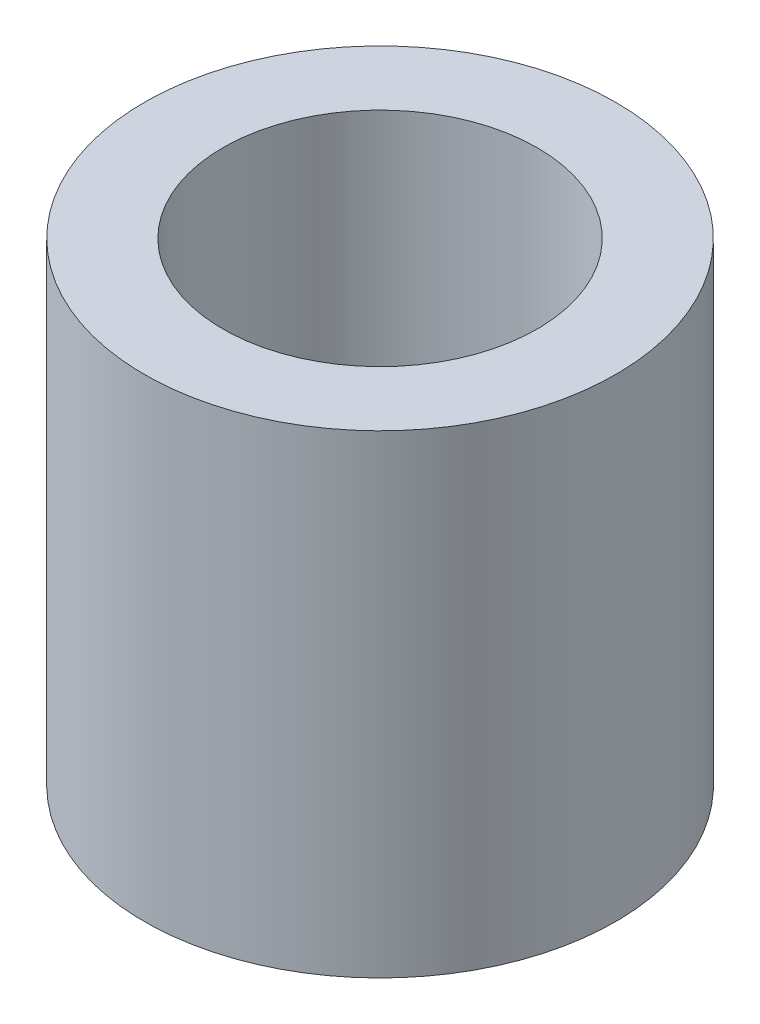
ISO-10303-21;
HEADER;
FILE_DESCRIPTION(('STEP AP214'),'2;1');
FILE_NAME('part.step','',(''),(''),'','','');
FILE_SCHEMA(('AUTOMOTIVE_DESIGN { 1 0 10303 214 1 1 1 1 }'));
ENDSEC;
DATA;
#1=APPLICATION_CONTEXT('core data for automotive mechanical design processes');
#2=APPLICATION_PROTOCOL_DEFINITION('international standard','automotive_design',2000,#1);
#3=PRODUCT_CONTEXT('',#1,'mechanical');
#4=PRODUCT('Part','Part','',(#3));
#5=PRODUCT_RELATED_PRODUCT_CATEGORY('part','',(#4));
#6=PRODUCT_DEFINITION_FORMATION('','',#4);
#7=PRODUCT_DEFINITION_CONTEXT('part definition',#1,'design');
#8=PRODUCT_DEFINITION('design','',#6,#7);
#9=PRODUCT_DEFINITION_SHAPE('','',#8);
#10=(LENGTH_UNIT() NAMED_UNIT(*) SI_UNIT(.MILLI.,.METRE.));
#11=(NAMED_UNIT(*) PLANE_ANGLE_UNIT() SI_UNIT($,.RADIAN.));
#12=(NAMED_UNIT(*) SI_UNIT($,.STERADIAN.) SOLID_ANGLE_UNIT());
#13=UNCERTAINTY_MEASURE_WITH_UNIT(LENGTH_MEASURE(1.E-05),#10,'distance_accuracy_value','');
#14=(GEOMETRIC_REPRESENTATION_CONTEXT(3) GLOBAL_UNCERTAINTY_ASSIGNED_CONTEXT((#13)) GLOBAL_UNIT_ASSIGNED_CONTEXT((#10,
#11,#12)) REPRESENTATION_CONTEXT('',''));
#15=CARTESIAN_POINT('',(0.,0.,0.));
#16=DIRECTION('',(0.,0.,1.));
#17=DIRECTION('',(1.,0.,0.));
#18=AXIS2_PLACEMENT_3D('',#15,#16,#17);
#19=CARTESIAN_POINT('',(0.,6.03156727044344,0.));
#20=DIRECTION('',(0.,1.,0.));
#21=DIRECTION('',(0.,0.,1.));
#22=AXIS2_PLACEMENT_3D('',#19,#20,#21);
#23=PLANE('',#22);
#24=CARTESIAN_POINT('',(0.,6.03156727044344,0.));
#25=DIRECTION('',(0.,1.,0.));
#26=DIRECTION('',(0.,0.,1.));
#27=AXIS2_PLACEMENT_3D('',#24,#25,#26);
#28=CIRCLE('',#27,3.);
#29=CARTESIAN_POINT('',(0.,6.03156727044344,-3.));
#30=VERTEX_POINT('',#29);
#31=EDGE_CURVE('E10',#30,#30,#28,.T.);
#32=ORIENTED_EDGE('',*,*,#31,.T.);
#33=EDGE_LOOP('',(#32));
#34=FACE_BOUND('',#33,.T.);
#35=CARTESIAN_POINT('',(0.,6.03156727044344,0.));
#36=DIRECTION('',(0.,1.,0.));
#37=DIRECTION('',(0.,0.,1.));
#38=AXIS2_PLACEMENT_3D('',#35,#36,#37);
#39=CIRCLE('',#38,2.);
#40=CARTESIAN_POINT('',(0.,6.03156727044344,-2.));
#41=VERTEX_POINT('',#40);
#42=EDGE_CURVE('E46',#41,#41,#39,.T.);
#43=ORIENTED_EDGE('',*,*,#42,.F.);
#44=EDGE_LOOP('',(#43));
#45=FACE_BOUND('',#44,.T.);
#46=ADVANCED_FACE('F35',(#34,#45),#23,.T.);
#47=CARTESIAN_POINT('',(0.,0.,0.));
#48=DIRECTION('',(0.,1.,0.));
#49=DIRECTION('',(0.,0.,1.));
#50=AXIS2_PLACEMENT_3D('',#47,#48,#49);
#51=PLANE('',#50);
#52=CARTESIAN_POINT('',(0.,0.,0.));
#53=DIRECTION('',(0.,1.,0.));
#54=DIRECTION('',(0.,0.,1.));
#55=AXIS2_PLACEMENT_3D('',#52,#53,#54);
#56=CIRCLE('',#55,3.);
#57=CARTESIAN_POINT('',(0.,0.,-3.));
#58=VERTEX_POINT('',#57);
#59=EDGE_CURVE('E39',#58,#58,#56,.T.);
#60=ORIENTED_EDGE('',*,*,#59,.F.);
#61=EDGE_LOOP('',(#60));
#62=FACE_BOUND('',#61,.T.);
#63=CARTESIAN_POINT('',(0.,0.,0.));
#64=DIRECTION('',(0.,1.,0.));
#65=DIRECTION('',(0.,0.,1.));
#66=AXIS2_PLACEMENT_3D('',#63,#64,#65);
#67=CIRCLE('',#66,2.);
#68=CARTESIAN_POINT('',(0.,0.,-2.));
#69=VERTEX_POINT('',#68);
#70=EDGE_CURVE('E48',#69,#69,#67,.T.);
#71=ORIENTED_EDGE('',*,*,#70,.T.);
#72=EDGE_LOOP('',(#71));
#73=FACE_BOUND('',#72,.T.);
#74=ADVANCED_FACE('F58',(#62,#73),#51,.F.);
#75=CARTESIAN_POINT('',(0.,6.03156727044344,0.));
#76=DIRECTION('',(0.,-1.,0.));
#77=DIRECTION('',(0.,0.,-1.));
#78=AXIS2_PLACEMENT_3D('',#75,#76,#77);
#79=CYLINDRICAL_SURFACE('',#78,3.);
#80=CARTESIAN_POINT('',(0.,6.03156727044344,-3.));
#81=CARTESIAN_POINT('',(0.,5.96873844470965,-3.));
#82=CARTESIAN_POINT('',(0.,5.90590961897587,-3.));
#83=CARTESIAN_POINT('',(0.,5.7802519675083,-3.));
#84=CARTESIAN_POINT('',(0.,5.71742314177451,-3.));
#85=CARTESIAN_POINT('',(0.,5.59176549030694,-3.));
#86=CARTESIAN_POINT('',(0.,5.52893666457315,-3.));
#87=CARTESIAN_POINT('',(0.,5.40327901310558,-3.));
#88=CARTESIAN_POINT('',(0.,5.3404501873718,-3.));
#89=CARTESIAN_POINT('',(0.,5.21479253590423,-3.));
#90=CARTESIAN_POINT('',(0.,5.15196371017044,-3.));
#91=CARTESIAN_POINT('',(0.,5.02630605870287,-3.));
#92=CARTESIAN_POINT('',(0.,4.96347723296908,-3.));
#93=CARTESIAN_POINT('',(0.,4.83781958150151,-3.));
#94=CARTESIAN_POINT('',(0.,4.77499075576772,-3.));
#95=CARTESIAN_POINT('',(0.,4.64933310430015,-3.));
#96=CARTESIAN_POINT('',(0.,4.58650427856637,-3.));
#97=CARTESIAN_POINT('',(0.,4.46084662709879,-3.));
#98=CARTESIAN_POINT('',(0.,4.39801780136501,-3.));
#99=CARTESIAN_POINT('',(0.,4.27236014989744,-3.));
#100=CARTESIAN_POINT('',(0.,4.20953132416365,-3.));
#101=CARTESIAN_POINT('',(0.,4.08387367269608,-3.));
#102=CARTESIAN_POINT('',(0.,4.02104484696229,-3.));
#103=CARTESIAN_POINT('',(0.,3.89538719549472,-3.));
#104=CARTESIAN_POINT('',(0.,3.83255836976094,-3.));
#105=CARTESIAN_POINT('',(0.,3.70690071829336,-3.));
#106=CARTESIAN_POINT('',(0.,3.64407189255958,-3.));
#107=CARTESIAN_POINT('',(0.,3.51841424109201,-3.));
#108=CARTESIAN_POINT('',(0.,3.45558541535822,-3.));
#109=CARTESIAN_POINT('',(0.,3.32992776389065,-3.));
#110=CARTESIAN_POINT('',(0.,3.26709893815686,-3.));
#111=CARTESIAN_POINT('',(0.,3.14144128668929,-3.));
#112=CARTESIAN_POINT('',(0.,3.07861246095551,-3.));
#113=CARTESIAN_POINT('',(0.,2.95295480948793,-3.));
#114=CARTESIAN_POINT('',(0.,2.89012598375415,-3.));
#115=CARTESIAN_POINT('',(0.,2.76446833228658,-3.));
#116=CARTESIAN_POINT('',(0.,2.70163950655279,-3.));
#117=CARTESIAN_POINT('',(0.,2.57598185508522,-3.));
#118=CARTESIAN_POINT('',(0.,2.51315302935143,-3.));
#119=CARTESIAN_POINT('',(0.,2.38749537788386,-3.));
#120=CARTESIAN_POINT('',(0.,2.32466655215008,-3.));
#121=CARTESIAN_POINT('',(0.,2.1990089006825,-3.));
#122=CARTESIAN_POINT('',(0.,2.13618007494872,-3.));
#123=CARTESIAN_POINT('',(0.,2.01052242348115,-3.));
#124=CARTESIAN_POINT('',(0.,1.94769359774736,-3.));
#125=CARTESIAN_POINT('',(0.,1.82203594627979,-3.));
#126=CARTESIAN_POINT('',(0.,1.759207120546,-3.));
#127=CARTESIAN_POINT('',(0.,1.63354946907843,-3.));
#128=CARTESIAN_POINT('',(0.,1.57072064334465,-3.));
#129=CARTESIAN_POINT('',(0.,1.44506299187707,-3.));
#130=CARTESIAN_POINT('',(0.,1.38223416614329,-3.));
#131=CARTESIAN_POINT('',(0.,1.25657651467572,-3.));
#132=CARTESIAN_POINT('',(0.,1.19374768894193,-3.));
#133=CARTESIAN_POINT('',(0.,1.06809003747436,-3.));
#134=CARTESIAN_POINT('',(0.,1.00526121174057,-3.));
#135=CARTESIAN_POINT('',(0.,0.879603560273002,-3.));
#136=CARTESIAN_POINT('',(0.,0.816774734539216,-3.));
#137=CARTESIAN_POINT('',(0.,0.691117083071644,-3.));
#138=CARTESIAN_POINT('',(0.,0.628288257337859,-3.));
#139=CARTESIAN_POINT('',(0.,0.502630605870287,-3.));
#140=CARTESIAN_POINT('',(0.,0.439801780136501,-3.));
#141=CARTESIAN_POINT('',(0.,0.314144128668929,-3.));
#142=CARTESIAN_POINT('',(0.,0.251315302935143,-3.));
#143=CARTESIAN_POINT('',(0.,0.125657651467572,-3.));
#144=CARTESIAN_POINT('',(0.,0.0628288257337857,-3.));
#145=CARTESIAN_POINT('',(0.,0.,-3.));
#146=B_SPLINE_CURVE_WITH_KNOTS('',3,(#80,#81,#82,#83,#84,#85,#86,#87,#88,#89,#90,#91,#92,#93,
#94,#95,#96,#97,#98,#99,#100,#101,#102,#103,#104,#105,#106,#107,#108,#109,#110,#111,#112,#113,
#114,#115,#116,#117,#118,#119,#120,#121,#122,#123,#124,#125,#126,#127,#128,#129,#130,#131,#132,
#133,#134,#135,#136,#137,#138,#139,#140,#141,#142,#143,#144,#145),.UNSPECIFIED.,.F.,.F.,(4,2,2,
2,2,2,2,2,2,2,2,2,2,2,2,2,2,2,2,2,2,2,2,2,2,2,2,2,2,2,2,2,4),(0.,0.188486477201357,
0.376972954402715,0.565459431604072,0.753945908805429,0.942432386006787,1.13091886320814,
1.3194053404095,1.50789181761086,1.69637829481222,1.88486477201357,2.07335124921493,
2.26183772641629,2.45032420361765,2.638810680819,2.82729715802036,3.01578363522172,
3.20427011242308,3.39275658962443,3.58124306682579,3.76972954402715,3.95821602122851,
4.14670249842986,4.33518897563122,4.52367545283258,4.71216193003394,4.90064840723529,
5.08913488443665,5.27762136163801,5.46610783883937,5.65459431604072,5.84308079324208,
6.03156727044344),.UNSPECIFIED.);
#147=EDGE_CURVE('BSEAM37',#30,#58,#146,.T.);
#148=ORIENTED_EDGE('',*,*,#31,.F.);
#149=ORIENTED_EDGE('',*,*,#59,.T.);
#150=ORIENTED_EDGE('',*,*,#147,.T.);
#151=ORIENTED_EDGE('',*,*,#147,.F.);
#152=EDGE_LOOP('',(#148,#150,#149,#151));
#153=FACE_BOUND('',#152,.T.);
#154=ADVANCED_FACE('F37',(#153),#79,.T.);
#155=CARTESIAN_POINT('',(0.,6.03156727044344,0.));
#156=DIRECTION('',(0.,-1.,0.));
#157=DIRECTION('',(0.,0.,-1.));
#158=AXIS2_PLACEMENT_3D('',#155,#156,#157);
#159=CYLINDRICAL_SURFACE('',#158,2.);
#160=CARTESIAN_POINT('',(0.,6.03156727044344,-2.));
#161=CARTESIAN_POINT('',(0.,5.96873844470965,-2.));
#162=CARTESIAN_POINT('',(0.,5.90590961897587,-2.));
#163=CARTESIAN_POINT('',(0.,5.7802519675083,-2.));
#164=CARTESIAN_POINT('',(0.,5.71742314177451,-2.));
#165=CARTESIAN_POINT('',(0.,5.59176549030694,-2.));
#166=CARTESIAN_POINT('',(0.,5.52893666457315,-2.));
#167=CARTESIAN_POINT('',(0.,5.40327901310558,-2.));
#168=CARTESIAN_POINT('',(0.,5.3404501873718,-2.));
#169=CARTESIAN_POINT('',(0.,5.21479253590422,-2.));
#170=CARTESIAN_POINT('',(0.,5.15196371017044,-2.));
#171=CARTESIAN_POINT('',(0.,5.02630605870287,-2.));
#172=CARTESIAN_POINT('',(0.,4.96347723296908,-2.));
#173=CARTESIAN_POINT('',(0.,4.83781958150151,-2.));
#174=CARTESIAN_POINT('',(0.,4.77499075576772,-2.));
#175=CARTESIAN_POINT('',(0.,4.64933310430015,-2.));
#176=CARTESIAN_POINT('',(0.,4.58650427856637,-2.));
#177=CARTESIAN_POINT('',(0.,4.46084662709879,-2.));
#178=CARTESIAN_POINT('',(0.,4.39801780136501,-2.));
#179=CARTESIAN_POINT('',(0.,4.27236014989744,-2.));
#180=CARTESIAN_POINT('',(0.,4.20953132416365,-2.));
#181=CARTESIAN_POINT('',(0.,4.08387367269608,-2.));
#182=CARTESIAN_POINT('',(0.,4.02104484696229,-2.));
#183=CARTESIAN_POINT('',(0.,3.89538719549472,-2.));
#184=CARTESIAN_POINT('',(0.,3.83255836976094,-2.));
#185=CARTESIAN_POINT('',(0.,3.70690071829336,-2.));
#186=CARTESIAN_POINT('',(0.,3.64407189255958,-2.));
#187=CARTESIAN_POINT('',(0.,3.51841424109201,-2.));
#188=CARTESIAN_POINT('',(0.,3.45558541535822,-2.));
#189=CARTESIAN_POINT('',(0.,3.32992776389065,-2.));
#190=CARTESIAN_POINT('',(0.,3.26709893815686,-2.));
#191=CARTESIAN_POINT('',(0.,3.14144128668929,-2.));
#192=CARTESIAN_POINT('',(0.,3.07861246095551,-2.));
#193=CARTESIAN_POINT('',(0.,2.95295480948793,-2.));
#194=CARTESIAN_POINT('',(0.,2.89012598375415,-2.));
#195=CARTESIAN_POINT('',(0.,2.76446833228658,-2.));
#196=CARTESIAN_POINT('',(0.,2.70163950655279,-2.));
#197=CARTESIAN_POINT('',(0.,2.57598185508522,-2.));
#198=CARTESIAN_POINT('',(0.,2.51315302935143,-2.));
#199=CARTESIAN_POINT('',(0.,2.38749537788386,-2.));
#200=CARTESIAN_POINT('',(0.,2.32466655215008,-2.));
#201=CARTESIAN_POINT('',(0.,2.1990089006825,-2.));
#202=CARTESIAN_POINT('',(0.,2.13618007494872,-2.));
#203=CARTESIAN_POINT('',(0.,2.01052242348115,-2.));
#204=CARTESIAN_POINT('',(0.,1.94769359774736,-2.));
#205=CARTESIAN_POINT('',(0.,1.82203594627979,-2.));
#206=CARTESIAN_POINT('',(0.,1.759207120546,-2.));
#207=CARTESIAN_POINT('',(0.,1.63354946907843,-2.));
#208=CARTESIAN_POINT('',(0.,1.57072064334465,-2.));
#209=CARTESIAN_POINT('',(0.,1.44506299187707,-2.));
#210=CARTESIAN_POINT('',(0.,1.38223416614329,-2.));
#211=CARTESIAN_POINT('',(0.,1.25657651467572,-2.));
#212=CARTESIAN_POINT('',(0.,1.19374768894193,-2.));
#213=CARTESIAN_POINT('',(0.,1.06809003747436,-2.));
#214=CARTESIAN_POINT('',(0.,1.00526121174057,-2.));
#215=CARTESIAN_POINT('',(0.,0.879603560273002,-2.));
#216=CARTESIAN_POINT('',(0.,0.816774734539216,-2.));
#217=CARTESIAN_POINT('',(0.,0.691117083071644,-2.));
#218=CARTESIAN_POINT('',(0.,0.628288257337858,-2.));
#219=CARTESIAN_POINT('',(0.,0.502630605870287,-2.));
#220=CARTESIAN_POINT('',(0.,0.439801780136501,-2.));
#221=CARTESIAN_POINT('',(0.,0.314144128668929,-2.));
#222=CARTESIAN_POINT('',(0.,0.251315302935143,-2.));
#223=CARTESIAN_POINT('',(0.,0.125657651467572,-2.));
#224=CARTESIAN_POINT('',(0.,0.0628288257337858,-2.));
#225=CARTESIAN_POINT('',(0.,0.,-2.));
#226=B_SPLINE_CURVE_WITH_KNOTS('',3,(#160,#161,#162,#163,#164,#165,#166,#167,#168,#169,#170,
#171,#172,#173,#174,#175,#176,#177,#178,#179,#180,#181,#182,#183,#184,#185,#186,#187,#188,#189,
#190,#191,#192,#193,#194,#195,#196,#197,#198,#199,#200,#201,#202,#203,#204,#205,#206,#207,#208,
#209,#210,#211,#212,#213,#214,#215,#216,#217,#218,#219,#220,#221,#222,#223,#224,#225),
.UNSPECIFIED.,.F.,.F.,(4,2,2,2,2,2,2,2,2,2,2,2,2,2,2,2,2,2,2,2,2,2,2,2,2,2,2,2,2,2,2,2,4),(0.,
0.188486477201358,0.376972954402715,0.565459431604073,0.753945908805431,0.942432386006788,
1.13091886320815,1.3194053404095,1.50789181761086,1.69637829481222,1.88486477201358,
2.07335124921493,2.26183772641629,2.45032420361765,2.63881068081901,2.82729715802036,
3.01578363522172,3.20427011242308,3.39275658962444,3.58124306682579,3.76972954402715,
3.95821602122851,4.14670249842987,4.33518897563122,4.52367545283258,4.71216193003394,
4.9006484072353,5.08913488443665,5.27762136163801,5.46610783883937,5.65459431604073,
5.84308079324208,6.03156727044344),.UNSPECIFIED.);
#227=EDGE_CURVE('BSEAM54',#41,#69,#226,.T.);
#228=ORIENTED_EDGE('',*,*,#42,.T.);
#229=ORIENTED_EDGE('',*,*,#70,.F.);
#230=ORIENTED_EDGE('',*,*,#227,.T.);
#231=ORIENTED_EDGE('',*,*,#227,.F.);
#232=EDGE_LOOP('',(#228,#230,#229,#231));
#233=FACE_BOUND('',#232,.T.);
#234=ADVANCED_FACE('F54',(#233),#159,.F.);
#235=CLOSED_SHELL('',(#46,#74,#154,#234));
#236=MANIFOLD_SOLID_BREP('B2',#235);
#237=ADVANCED_BREP_SHAPE_REPRESENTATION('',(#18,#236),#14);
#238=SHAPE_DEFINITION_REPRESENTATION(#9,#237);
ENDSEC;
END-ISO-10303-21;
